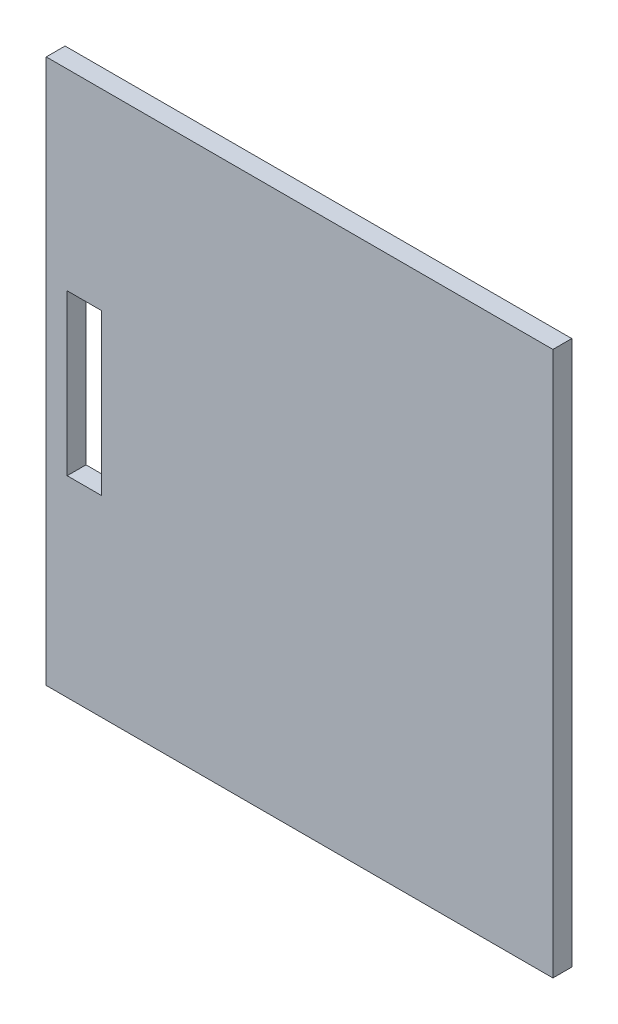
ISO-10303-21;
HEADER;
FILE_DESCRIPTION(('STEP AP214'),'2;1');
FILE_NAME('part.step','',(''),(''),'','','');
FILE_SCHEMA(('AUTOMOTIVE_DESIGN { 1 0 10303 214 1 1 1 1 }'));
ENDSEC;
DATA;
#1=APPLICATION_CONTEXT('core data for automotive mechanical design processes');
#2=APPLICATION_PROTOCOL_DEFINITION('international standard','automotive_design',2000,#1);
#3=PRODUCT_CONTEXT('',#1,'mechanical');
#4=PRODUCT('Part','Part','',(#3));
#5=PRODUCT_RELATED_PRODUCT_CATEGORY('part','',(#4));
#6=PRODUCT_DEFINITION_FORMATION('','',#4);
#7=PRODUCT_DEFINITION_CONTEXT('part definition',#1,'design');
#8=PRODUCT_DEFINITION('design','',#6,#7);
#9=PRODUCT_DEFINITION_SHAPE('','',#8);
#10=(LENGTH_UNIT() NAMED_UNIT(*) SI_UNIT(.MILLI.,.METRE.));
#11=(NAMED_UNIT(*) PLANE_ANGLE_UNIT() SI_UNIT($,.RADIAN.));
#12=(NAMED_UNIT(*) SI_UNIT($,.STERADIAN.) SOLID_ANGLE_UNIT());
#13=UNCERTAINTY_MEASURE_WITH_UNIT(LENGTH_MEASURE(1.E-05),#10,'distance_accuracy_value','');
#14=(GEOMETRIC_REPRESENTATION_CONTEXT(3) GLOBAL_UNCERTAINTY_ASSIGNED_CONTEXT((#13)) GLOBAL_UNIT_ASSIGNED_CONTEXT((#10,
#11,#12)) REPRESENTATION_CONTEXT('',''));
#15=CARTESIAN_POINT('',(0.,0.,0.));
#16=DIRECTION('',(0.,0.,1.));
#17=DIRECTION('',(1.,0.,0.));
#18=AXIS2_PLACEMENT_3D('',#15,#16,#17);
#19=CARTESIAN_POINT('',(0.,0.,4.5));
#20=DIRECTION('',(0.,0.,-1.));
#21=DIRECTION('',(-1.,0.,0.));
#22=AXIS2_PLACEMENT_3D('',#19,#20,#21);
#23=PLANE('',#22);
#24=DIRECTION('',(0.,1.,0.));
#25=VECTOR('',#24,1.);
#26=CARTESIAN_POINT('',(60.5,-65.,4.5));
#27=LINE('',#26,#25);
#28=CARTESIAN_POINT('',(60.5,-65.,4.5));
#29=VERTEX_POINT('',#28);
#30=CARTESIAN_POINT('',(60.5,65.,4.5));
#31=VERTEX_POINT('',#30);
#32=EDGE_CURVE('E134',#29,#31,#27,.T.);
#33=ORIENTED_EDGE('',*,*,#32,.T.);
#34=DIRECTION('',(-1.,0.,0.));
#35=VECTOR('',#34,1.);
#36=CARTESIAN_POINT('',(-60.5,65.,4.5));
#37=LINE('',#36,#35);
#38=CARTESIAN_POINT('',(-60.5,65.,4.5));
#39=VERTEX_POINT('',#38);
#40=EDGE_CURVE('E137',#31,#39,#37,.T.);
#41=ORIENTED_EDGE('',*,*,#40,.T.);
#42=DIRECTION('',(0.,-1.,0.));
#43=VECTOR('',#42,1.);
#44=CARTESIAN_POINT('',(-60.5,-65.,4.5));
#45=LINE('',#44,#43);
#46=CARTESIAN_POINT('',(-60.5,-65.,4.5));
#47=VERTEX_POINT('',#46);
#48=EDGE_CURVE('E140',#39,#47,#45,.T.);
#49=ORIENTED_EDGE('',*,*,#48,.T.);
#50=DIRECTION('',(1.,0.,0.));
#51=VECTOR('',#50,1.);
#52=CARTESIAN_POINT('',(-60.5,-65.,4.5));
#53=LINE('',#52,#51);
#54=EDGE_CURVE('E142',#47,#29,#53,.T.);
#55=ORIENTED_EDGE('',*,*,#54,.T.);
#56=EDGE_LOOP('',(#33,#41,#49,#55));
#57=FACE_BOUND('',#56,.T.);
#58=DIRECTION('',(1.,0.,0.));
#59=VECTOR('',#58,1.);
#60=CARTESIAN_POINT('',(-47.3,-19.125,4.5));
#61=LINE('',#60,#59);
#62=CARTESIAN_POINT('',(-55.5,-19.125,4.5));
#63=VERTEX_POINT('',#62);
#64=CARTESIAN_POINT('',(-47.3,-19.125,4.5));
#65=VERTEX_POINT('',#64);
#66=EDGE_CURVE('E98',#63,#65,#61,.T.);
#67=ORIENTED_EDGE('',*,*,#66,.F.);
#68=DIRECTION('',(0.,-1.,0.));
#69=VECTOR('',#68,1.);
#70=CARTESIAN_POINT('',(-55.5,-19.125,4.5));
#71=LINE('',#70,#69);
#72=CARTESIAN_POINT('',(-55.5,19.125,4.5));
#73=VERTEX_POINT('',#72);
#74=EDGE_CURVE('E120',#73,#63,#71,.T.);
#75=ORIENTED_EDGE('',*,*,#74,.F.);
#76=DIRECTION('',(-1.,0.,0.));
#77=VECTOR('',#76,1.);
#78=CARTESIAN_POINT('',(-47.3,19.125,4.5));
#79=LINE('',#78,#77);
#80=CARTESIAN_POINT('',(-47.3,19.125,4.5));
#81=VERTEX_POINT('',#80);
#82=EDGE_CURVE('E118',#81,#73,#79,.T.);
#83=ORIENTED_EDGE('',*,*,#82,.F.);
#84=DIRECTION('',(0.,1.,0.));
#85=VECTOR('',#84,1.);
#86=CARTESIAN_POINT('',(-47.3,-19.125,4.5));
#87=LINE('',#86,#85);
#88=EDGE_CURVE('E106',#65,#81,#87,.T.);
#89=ORIENTED_EDGE('',*,*,#88,.F.);
#90=EDGE_LOOP('',(#67,#75,#83,#89));
#91=FACE_BOUND('',#90,.T.);
#92=ADVANCED_FACE('F33',(#57,#91),#23,.F.);
#93=CARTESIAN_POINT('',(0.,0.,0.));
#94=DIRECTION('',(0.,0.,-1.));
#95=DIRECTION('',(-1.,0.,0.));
#96=AXIS2_PLACEMENT_3D('',#93,#94,#95);
#97=PLANE('',#96);
#98=DIRECTION('',(0.,1.,0.));
#99=VECTOR('',#98,1.);
#100=CARTESIAN_POINT('',(60.5,-65.,0.));
#101=LINE('',#100,#99);
#102=CARTESIAN_POINT('',(60.5,-65.,0.));
#103=VERTEX_POINT('',#102);
#104=CARTESIAN_POINT('',(60.5,65.,0.));
#105=VERTEX_POINT('',#104);
#106=EDGE_CURVE('E114',#103,#105,#101,.T.);
#107=ORIENTED_EDGE('',*,*,#106,.F.);
#108=DIRECTION('',(1.,0.,0.));
#109=VECTOR('',#108,1.);
#110=CARTESIAN_POINT('',(-60.5,-65.,0.));
#111=LINE('',#110,#109);
#112=CARTESIAN_POINT('',(-60.5,-65.,0.));
#113=VERTEX_POINT('',#112);
#114=EDGE_CURVE('E138',#113,#103,#111,.T.);
#115=ORIENTED_EDGE('',*,*,#114,.F.);
#116=DIRECTION('',(0.,-1.,0.));
#117=VECTOR('',#116,1.);
#118=CARTESIAN_POINT('',(-60.5,-65.,0.));
#119=LINE('',#118,#117);
#120=CARTESIAN_POINT('',(-60.5,65.,0.));
#121=VERTEX_POINT('',#120);
#122=EDGE_CURVE('E149',#121,#113,#119,.T.);
#123=ORIENTED_EDGE('',*,*,#122,.F.);
#124=DIRECTION('',(-1.,0.,0.));
#125=VECTOR('',#124,1.);
#126=CARTESIAN_POINT('',(-60.5,65.,0.));
#127=LINE('',#126,#125);
#128=EDGE_CURVE('E147',#105,#121,#127,.T.);
#129=ORIENTED_EDGE('',*,*,#128,.F.);
#130=EDGE_LOOP('',(#107,#115,#123,#129));
#131=FACE_BOUND('',#130,.T.);
#132=DIRECTION('',(0.,-1.,0.));
#133=VECTOR('',#132,1.);
#134=CARTESIAN_POINT('',(-55.5,-19.125,0.));
#135=LINE('',#134,#133);
#136=CARTESIAN_POINT('',(-55.5,19.125,0.));
#137=VERTEX_POINT('',#136);
#138=CARTESIAN_POINT('',(-55.5,-19.125,0.));
#139=VERTEX_POINT('',#138);
#140=EDGE_CURVE('E107',#137,#139,#135,.T.);
#141=ORIENTED_EDGE('',*,*,#140,.T.);
#142=DIRECTION('',(1.,0.,0.));
#143=VECTOR('',#142,1.);
#144=CARTESIAN_POINT('',(-47.3,-19.125,0.));
#145=LINE('',#144,#143);
#146=CARTESIAN_POINT('',(-47.3,-19.125,0.));
#147=VERTEX_POINT('',#146);
#148=EDGE_CURVE('E56',#139,#147,#145,.T.);
#149=ORIENTED_EDGE('',*,*,#148,.T.);
#150=DIRECTION('',(0.,1.,0.));
#151=VECTOR('',#150,1.);
#152=CARTESIAN_POINT('',(-47.3,-19.125,0.));
#153=LINE('',#152,#151);
#154=CARTESIAN_POINT('',(-47.3,19.125,0.));
#155=VERTEX_POINT('',#154);
#156=EDGE_CURVE('E113',#147,#155,#153,.T.);
#157=ORIENTED_EDGE('',*,*,#156,.T.);
#158=DIRECTION('',(-1.,0.,0.));
#159=VECTOR('',#158,1.);
#160=CARTESIAN_POINT('',(-47.3,19.125,0.));
#161=LINE('',#160,#159);
#162=EDGE_CURVE('E126',#155,#137,#161,.T.);
#163=ORIENTED_EDGE('',*,*,#162,.T.);
#164=EDGE_LOOP('',(#141,#149,#157,#163));
#165=FACE_BOUND('',#164,.T.);
#166=ADVANCED_FACE('F167',(#131,#165),#97,.T.);
#167=CARTESIAN_POINT('',(60.5,-65.,4.5));
#168=DIRECTION('',(-1.,0.,0.));
#169=DIRECTION('',(0.,0.,1.));
#170=AXIS2_PLACEMENT_3D('',#167,#168,#169);
#171=PLANE('',#170);
#172=ORIENTED_EDGE('',*,*,#106,.T.);
#173=DIRECTION('',(0.,0.,-1.));
#174=VECTOR('',#173,1.);
#175=CARTESIAN_POINT('',(60.5,65.,4.5));
#176=LINE('',#175,#174);
#177=EDGE_CURVE('E11',#31,#105,#176,.T.);
#178=ORIENTED_EDGE('',*,*,#177,.F.);
#179=ORIENTED_EDGE('',*,*,#32,.F.);
#180=DIRECTION('',(0.,0.,-1.));
#181=VECTOR('',#180,1.);
#182=CARTESIAN_POINT('',(60.5,-65.,4.5));
#183=LINE('',#182,#181);
#184=EDGE_CURVE('E144',#29,#103,#183,.T.);
#185=ORIENTED_EDGE('',*,*,#184,.T.);
#186=EDGE_LOOP('',(#172,#178,#179,#185));
#187=FACE_BOUND('',#186,.T.);
#188=ADVANCED_FACE('F35',(#187),#171,.F.);
#189=CARTESIAN_POINT('',(-60.5,65.,4.5));
#190=DIRECTION('',(0.,-1.,0.));
#191=DIRECTION('',(0.,0.,-1.));
#192=AXIS2_PLACEMENT_3D('',#189,#190,#191);
#193=PLANE('',#192);
#194=ORIENTED_EDGE('',*,*,#128,.T.);
#195=DIRECTION('',(0.,0.,-1.));
#196=VECTOR('',#195,1.);
#197=CARTESIAN_POINT('',(-60.5,65.,4.5));
#198=LINE('',#197,#196);
#199=EDGE_CURVE('E41',#39,#121,#198,.T.);
#200=ORIENTED_EDGE('',*,*,#199,.F.);
#201=ORIENTED_EDGE('',*,*,#40,.F.);
#202=ORIENTED_EDGE('',*,*,#177,.T.);
#203=EDGE_LOOP('',(#194,#200,#201,#202));
#204=FACE_BOUND('',#203,.T.);
#205=ADVANCED_FACE('F177',(#204),#193,.F.);
#206=CARTESIAN_POINT('',(-60.5,-65.,4.5));
#207=DIRECTION('',(1.,0.,0.));
#208=DIRECTION('',(0.,0.,-1.));
#209=AXIS2_PLACEMENT_3D('',#206,#207,#208);
#210=PLANE('',#209);
#211=ORIENTED_EDGE('',*,*,#122,.T.);
#212=DIRECTION('',(0.,0.,-1.));
#213=VECTOR('',#212,1.);
#214=CARTESIAN_POINT('',(-60.5,-65.,4.5));
#215=LINE('',#214,#213);
#216=EDGE_CURVE('E154',#47,#113,#215,.T.);
#217=ORIENTED_EDGE('',*,*,#216,.F.);
#218=ORIENTED_EDGE('',*,*,#48,.F.);
#219=ORIENTED_EDGE('',*,*,#199,.T.);
#220=EDGE_LOOP('',(#211,#217,#218,#219));
#221=FACE_BOUND('',#220,.T.);
#222=ADVANCED_FACE('F161',(#221),#210,.F.);
#223=CARTESIAN_POINT('',(-60.5,-65.,4.5));
#224=DIRECTION('',(0.,1.,0.));
#225=DIRECTION('',(0.,0.,1.));
#226=AXIS2_PLACEMENT_3D('',#223,#224,#225);
#227=PLANE('',#226);
#228=ORIENTED_EDGE('',*,*,#114,.T.);
#229=ORIENTED_EDGE('',*,*,#184,.F.);
#230=ORIENTED_EDGE('',*,*,#54,.F.);
#231=ORIENTED_EDGE('',*,*,#216,.T.);
#232=EDGE_LOOP('',(#228,#229,#230,#231));
#233=FACE_BOUND('',#232,.T.);
#234=ADVANCED_FACE('F171',(#233),#227,.F.);
#235=CARTESIAN_POINT('',(-47.3,-19.125,4.5));
#236=DIRECTION('',(0.,1.,0.));
#237=DIRECTION('',(0.,0.,1.));
#238=AXIS2_PLACEMENT_3D('',#235,#236,#237);
#239=PLANE('',#238);
#240=ORIENTED_EDGE('',*,*,#148,.F.);
#241=DIRECTION('',(0.,0.,-1.));
#242=VECTOR('',#241,1.);
#243=CARTESIAN_POINT('',(-55.5,-19.125,4.5));
#244=LINE('',#243,#242);
#245=EDGE_CURVE('E102',#63,#139,#244,.T.);
#246=ORIENTED_EDGE('',*,*,#245,.F.);
#247=ORIENTED_EDGE('',*,*,#66,.T.);
#248=DIRECTION('',(0.,0.,-1.));
#249=VECTOR('',#248,1.);
#250=CARTESIAN_POINT('',(-47.3,-19.125,4.5));
#251=LINE('',#250,#249);
#252=EDGE_CURVE('E101',#65,#147,#251,.T.);
#253=ORIENTED_EDGE('',*,*,#252,.T.);
#254=EDGE_LOOP('',(#240,#246,#247,#253));
#255=FACE_BOUND('',#254,.T.);
#256=ADVANCED_FACE('F100',(#255),#239,.T.);
#257=CARTESIAN_POINT('',(-47.3,-19.125,4.5));
#258=DIRECTION('',(-1.,0.,0.));
#259=DIRECTION('',(0.,0.,1.));
#260=AXIS2_PLACEMENT_3D('',#257,#258,#259);
#261=PLANE('',#260);
#262=ORIENTED_EDGE('',*,*,#156,.F.);
#263=ORIENTED_EDGE('',*,*,#252,.F.);
#264=ORIENTED_EDGE('',*,*,#88,.T.);
#265=DIRECTION('',(0.,0.,-1.));
#266=VECTOR('',#265,1.);
#267=CARTESIAN_POINT('',(-47.3,19.125,4.5));
#268=LINE('',#267,#266);
#269=EDGE_CURVE('E115',#81,#155,#268,.T.);
#270=ORIENTED_EDGE('',*,*,#269,.T.);
#271=EDGE_LOOP('',(#262,#263,#264,#270));
#272=FACE_BOUND('',#271,.T.);
#273=ADVANCED_FACE('F110',(#272),#261,.T.);
#274=CARTESIAN_POINT('',(-47.3,19.125,4.5));
#275=DIRECTION('',(0.,-1.,0.));
#276=DIRECTION('',(0.,0.,-1.));
#277=AXIS2_PLACEMENT_3D('',#274,#275,#276);
#278=PLANE('',#277);
#279=ORIENTED_EDGE('',*,*,#162,.F.);
#280=ORIENTED_EDGE('',*,*,#269,.F.);
#281=ORIENTED_EDGE('',*,*,#82,.T.);
#282=DIRECTION('',(0.,0.,-1.));
#283=VECTOR('',#282,1.);
#284=CARTESIAN_POINT('',(-55.5,19.125,4.5));
#285=LINE('',#284,#283);
#286=EDGE_CURVE('E48',#73,#137,#285,.T.);
#287=ORIENTED_EDGE('',*,*,#286,.T.);
#288=EDGE_LOOP('',(#279,#280,#281,#287));
#289=FACE_BOUND('',#288,.T.);
#290=ADVANCED_FACE('F200',(#289),#278,.T.);
#291=CARTESIAN_POINT('',(-55.5,-19.125,4.5));
#292=DIRECTION('',(1.,0.,0.));
#293=DIRECTION('',(0.,0.,-1.));
#294=AXIS2_PLACEMENT_3D('',#291,#292,#293);
#295=PLANE('',#294);
#296=ORIENTED_EDGE('',*,*,#140,.F.);
#297=ORIENTED_EDGE('',*,*,#286,.F.);
#298=ORIENTED_EDGE('',*,*,#74,.T.);
#299=ORIENTED_EDGE('',*,*,#245,.T.);
#300=EDGE_LOOP('',(#296,#297,#298,#299));
#301=FACE_BOUND('',#300,.T.);
#302=ADVANCED_FACE('F204',(#301),#295,.T.);
#303=CLOSED_SHELL('',(#92,#166,#188,#205,#222,#234,#256,#273,#290,#302));
#304=MANIFOLD_SOLID_BREP('B2',#303);
#305=ADVANCED_BREP_SHAPE_REPRESENTATION('',(#18,#304),#14);
#306=SHAPE_DEFINITION_REPRESENTATION(#9,#305);
ENDSEC;
END-ISO-10303-21;
